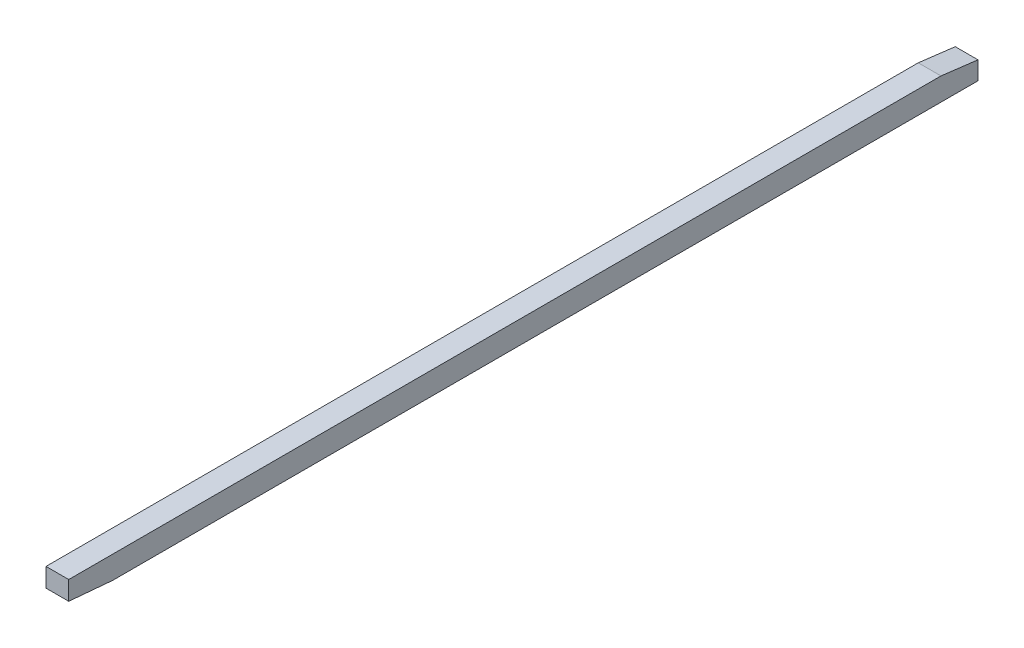
ISO-10303-21;
HEADER;
FILE_DESCRIPTION(('STEP AP214'),'2;1');
FILE_NAME('part.step','',(''),(''),'','','');
FILE_SCHEMA(('AUTOMOTIVE_DESIGN { 1 0 10303 214 1 1 1 1 }'));
ENDSEC;
DATA;
#1=APPLICATION_CONTEXT('core data for automotive mechanical design processes');
#2=APPLICATION_PROTOCOL_DEFINITION('international standard','automotive_design',2000,#1);
#3=PRODUCT_CONTEXT('',#1,'mechanical');
#4=PRODUCT('Part','Part','',(#3));
#5=PRODUCT_RELATED_PRODUCT_CATEGORY('part','',(#4));
#6=PRODUCT_DEFINITION_FORMATION('','',#4);
#7=PRODUCT_DEFINITION_CONTEXT('part definition',#1,'design');
#8=PRODUCT_DEFINITION('design','',#6,#7);
#9=PRODUCT_DEFINITION_SHAPE('','',#8);
#10=(LENGTH_UNIT() NAMED_UNIT(*) SI_UNIT(.MILLI.,.METRE.));
#11=(NAMED_UNIT(*) PLANE_ANGLE_UNIT() SI_UNIT($,.RADIAN.));
#12=(NAMED_UNIT(*) SI_UNIT($,.STERADIAN.) SOLID_ANGLE_UNIT());
#13=UNCERTAINTY_MEASURE_WITH_UNIT(LENGTH_MEASURE(1.E-05),#10,'distance_accuracy_value','');
#14=(GEOMETRIC_REPRESENTATION_CONTEXT(3) GLOBAL_UNCERTAINTY_ASSIGNED_CONTEXT((#13)) GLOBAL_UNIT_ASSIGNED_CONTEXT((#10,
#11,#12)) REPRESENTATION_CONTEXT('',''));
#15=CARTESIAN_POINT('',(0.,0.,0.));
#16=DIRECTION('',(0.,0.,1.));
#17=DIRECTION('',(1.,0.,0.));
#18=AXIS2_PLACEMENT_3D('',#15,#16,#17);
#19=CARTESIAN_POINT('',(0.,0.,101.6));
#20=DIRECTION('',(-1.,0.,0.));
#21=DIRECTION('',(0.,0.,1.));
#22=AXIS2_PLACEMENT_3D('',#19,#20,#21);
#23=PLANE('',#22);
#24=DIRECTION('',(0.,1.,0.));
#25=VECTOR('',#24,1.);
#26=CARTESIAN_POINT('',(0.,0.,0.));
#27=LINE('',#26,#25);
#28=CARTESIAN_POINT('',(0.,0.,0.));
#29=VERTEX_POINT('',#28);
#30=CARTESIAN_POINT('',(0.,2.032,0.));
#31=VERTEX_POINT('',#30);
#32=EDGE_CURVE('E142',#29,#31,#27,.T.);
#33=ORIENTED_EDGE('',*,*,#32,.T.);
#34=DIRECTION('',(0.,-0.121869343405148,-0.992546151641322));
#35=VECTOR('',#34,1.);
#36=CARTESIAN_POINT('',(0.,2.54,4.13732798541108));
#37=LINE('',#36,#35);
#38=CARTESIAN_POINT('',(0.,2.54,4.13732798541108));
#39=VERTEX_POINT('',#38);
#40=EDGE_CURVE('E11',#31,#39,#37,.F.);
#41=ORIENTED_EDGE('',*,*,#40,.T.);
#42=DIRECTION('',(0.,0.,-1.));
#43=VECTOR('',#42,1.);
#44=CARTESIAN_POINT('',(0.,2.54,101.6));
#45=LINE('',#44,#43);
#46=CARTESIAN_POINT('',(0.,2.54,101.6));
#47=VERTEX_POINT('',#46);
#48=EDGE_CURVE('E113',#47,#39,#45,.T.);
#49=ORIENTED_EDGE('',*,*,#48,.F.);
#50=DIRECTION('',(0.,1.,0.));
#51=VECTOR('',#50,1.);
#52=CARTESIAN_POINT('',(0.,0.,101.6));
#53=LINE('',#52,#51);
#54=CARTESIAN_POINT('',(0.,0.430444224547549,101.6));
#55=VERTEX_POINT('',#54);
#56=EDGE_CURVE('E97',#55,#47,#53,.T.);
#57=ORIENTED_EDGE('',*,*,#56,.F.);
#58=DIRECTION('',(0.,-0.0871557427476558,-0.996194698091746));
#59=VECTOR('',#58,1.);
#60=CARTESIAN_POINT('',(0.,0.430444224547549,101.6));
#61=LINE('',#60,#59);
#62=CARTESIAN_POINT('',(0.,0.,96.6799999999999));
#63=VERTEX_POINT('',#62);
#64=EDGE_CURVE('E121',#55,#63,#61,.T.);
#65=ORIENTED_EDGE('',*,*,#64,.T.);
#66=DIRECTION('',(0.,0.,-1.));
#67=VECTOR('',#66,1.);
#68=CARTESIAN_POINT('',(0.,0.,101.6));
#69=LINE('',#68,#67);
#70=EDGE_CURVE('E138',#63,#29,#69,.T.);
#71=ORIENTED_EDGE('',*,*,#70,.T.);
#72=EDGE_LOOP('',(#33,#41,#49,#57,#65,#71));
#73=FACE_BOUND('',#72,.T.);
#74=ADVANCED_FACE('F44',(#73),#23,.F.);
#75=CARTESIAN_POINT('',(0.,2.54,101.6));
#76=DIRECTION('',(0.,-1.,0.));
#77=DIRECTION('',(1.,0.,0.));
#78=AXIS2_PLACEMENT_3D('',#75,#76,#77);
#79=PLANE('',#78);
#80=ORIENTED_EDGE('',*,*,#48,.T.);
#81=DIRECTION('',(-1.,0.,0.));
#82=VECTOR('',#81,1.);
#83=CARTESIAN_POINT('',(0.,2.54,4.13732798541108));
#84=LINE('',#83,#82);
#85=CARTESIAN_POINT('',(-2.54,2.54,4.13732798541108));
#86=VERTEX_POINT('',#85);
#87=EDGE_CURVE('E132',#39,#86,#84,.T.);
#88=ORIENTED_EDGE('',*,*,#87,.T.);
#89=DIRECTION('',(0.,0.,-1.));
#90=VECTOR('',#89,1.);
#91=CARTESIAN_POINT('',(-2.54,2.54,101.6));
#92=LINE('',#91,#90);
#93=CARTESIAN_POINT('',(-2.54,2.54,101.6));
#94=VERTEX_POINT('',#93);
#95=EDGE_CURVE('E115',#94,#86,#92,.T.);
#96=ORIENTED_EDGE('',*,*,#95,.F.);
#97=DIRECTION('',(-1.,0.,0.));
#98=VECTOR('',#97,1.);
#99=CARTESIAN_POINT('',(0.,2.54,101.6));
#100=LINE('',#99,#98);
#101=EDGE_CURVE('E101',#47,#94,#100,.T.);
#102=ORIENTED_EDGE('',*,*,#101,.F.);
#103=EDGE_LOOP('',(#80,#88,#96,#102));
#104=FACE_BOUND('',#103,.T.);
#105=ADVANCED_FACE('F111',(#104),#79,.F.);
#106=CARTESIAN_POINT('',(-2.54,0.,101.6));
#107=DIRECTION('',(1.,0.,0.));
#108=DIRECTION('',(0.,0.,-1.));
#109=AXIS2_PLACEMENT_3D('',#106,#107,#108);
#110=PLANE('',#109);
#111=ORIENTED_EDGE('',*,*,#95,.T.);
#112=DIRECTION('',(0.,0.121869343405148,0.992546151641322));
#113=VECTOR('',#112,1.);
#114=CARTESIAN_POINT('',(-2.54,2.54,4.13732798541108));
#115=LINE('',#114,#113);
#116=CARTESIAN_POINT('',(-2.54,2.032,0.));
#117=VERTEX_POINT('',#116);
#118=EDGE_CURVE('E67',#86,#117,#115,.F.);
#119=ORIENTED_EDGE('',*,*,#118,.T.);
#120=DIRECTION('',(0.,-1.,0.));
#121=VECTOR('',#120,1.);
#122=CARTESIAN_POINT('',(-2.54,0.,0.));
#123=LINE('',#122,#121);
#124=CARTESIAN_POINT('',(-2.54,0.,0.));
#125=VERTEX_POINT('',#124);
#126=EDGE_CURVE('E144',#117,#125,#123,.T.);
#127=ORIENTED_EDGE('',*,*,#126,.T.);
#128=DIRECTION('',(0.,0.,-1.));
#129=VECTOR('',#128,1.);
#130=CARTESIAN_POINT('',(-2.54,0.,101.6));
#131=LINE('',#130,#129);
#132=CARTESIAN_POINT('',(-2.54,0.,96.6799999999999));
#133=VERTEX_POINT('',#132);
#134=EDGE_CURVE('E123',#133,#125,#131,.T.);
#135=ORIENTED_EDGE('',*,*,#134,.F.);
#136=DIRECTION('',(0.,0.0871557427476558,0.996194698091746));
#137=VECTOR('',#136,1.);
#138=CARTESIAN_POINT('',(-2.54,0.430444224547549,101.6));
#139=LINE('',#138,#137);
#140=CARTESIAN_POINT('',(-2.54,0.430444224547549,101.6));
#141=VERTEX_POINT('',#140);
#142=EDGE_CURVE('E130',#133,#141,#139,.T.);
#143=ORIENTED_EDGE('',*,*,#142,.T.);
#144=DIRECTION('',(0.,-1.,0.));
#145=VECTOR('',#144,1.);
#146=CARTESIAN_POINT('',(-2.54,0.,101.6));
#147=LINE('',#146,#145);
#148=EDGE_CURVE('E117',#94,#141,#147,.T.);
#149=ORIENTED_EDGE('',*,*,#148,.F.);
#150=EDGE_LOOP('',(#111,#119,#127,#135,#143,#149));
#151=FACE_BOUND('',#150,.T.);
#152=ADVANCED_FACE('F135',(#151),#110,.F.);
#153=CARTESIAN_POINT('',(0.,0.,101.6));
#154=DIRECTION('',(0.,1.,0.));
#155=DIRECTION('',(-1.,0.,0.));
#156=AXIS2_PLACEMENT_3D('',#153,#154,#155);
#157=PLANE('',#156);
#158=ORIENTED_EDGE('',*,*,#70,.F.);
#159=DIRECTION('',(-1.,0.,0.));
#160=VECTOR('',#159,1.);
#161=CARTESIAN_POINT('',(-2.54,0.,96.6799999999999));
#162=LINE('',#161,#160);
#163=EDGE_CURVE('E128',#63,#133,#162,.T.);
#164=ORIENTED_EDGE('',*,*,#163,.T.);
#165=ORIENTED_EDGE('',*,*,#134,.T.);
#166=DIRECTION('',(1.,0.,0.));
#167=VECTOR('',#166,1.);
#168=CARTESIAN_POINT('',(0.,0.,0.));
#169=LINE('',#168,#167);
#170=EDGE_CURVE('E107',#125,#29,#169,.T.);
#171=ORIENTED_EDGE('',*,*,#170,.T.);
#172=EDGE_LOOP('',(#158,#164,#165,#171));
#173=FACE_BOUND('',#172,.T.);
#174=ADVANCED_FACE('F151',(#173),#157,.F.);
#175=CARTESIAN_POINT('',(0.,0.,101.6));
#176=DIRECTION('',(0.,0.,1.));
#177=DIRECTION('',(1.,0.,0.));
#178=AXIS2_PLACEMENT_3D('',#175,#176,#177);
#179=PLANE('',#178);
#180=ORIENTED_EDGE('',*,*,#148,.T.);
#181=DIRECTION('',(1.,0.,0.));
#182=VECTOR('',#181,1.);
#183=CARTESIAN_POINT('',(0.,0.430444224547549,101.6));
#184=LINE('',#183,#182);
#185=EDGE_CURVE('E104',#141,#55,#184,.T.);
#186=ORIENTED_EDGE('',*,*,#185,.T.);
#187=ORIENTED_EDGE('',*,*,#56,.T.);
#188=ORIENTED_EDGE('',*,*,#101,.T.);
#189=EDGE_LOOP('',(#180,#186,#187,#188));
#190=FACE_BOUND('',#189,.T.);
#191=ADVANCED_FACE('F100',(#190),#179,.T.);
#192=CARTESIAN_POINT('',(0.,0.,0.));
#193=DIRECTION('',(0.,0.,1.));
#194=DIRECTION('',(1.,0.,0.));
#195=AXIS2_PLACEMENT_3D('',#192,#193,#194);
#196=PLANE('',#195);
#197=ORIENTED_EDGE('',*,*,#126,.F.);
#198=DIRECTION('',(1.,0.,0.));
#199=VECTOR('',#198,1.);
#200=CARTESIAN_POINT('',(0.,2.032,0.));
#201=LINE('',#200,#199);
#202=EDGE_CURVE('E53',#117,#31,#201,.T.);
#203=ORIENTED_EDGE('',*,*,#202,.T.);
#204=ORIENTED_EDGE('',*,*,#32,.F.);
#205=ORIENTED_EDGE('',*,*,#170,.F.);
#206=EDGE_LOOP('',(#197,#203,#204,#205));
#207=FACE_BOUND('',#206,.T.);
#208=ADVANCED_FACE('F153',(#207),#196,.F.);
#209=CARTESIAN_POINT('',(0.,0.430444224547549,101.6));
#210=DIRECTION('',(0.,-0.996194698091746,0.0871557427476558));
#211=DIRECTION('',(-1.,0.,0.));
#212=AXIS2_PLACEMENT_3D('',#209,#210,#211);
#213=PLANE('',#212);
#214=ORIENTED_EDGE('',*,*,#142,.F.);
#215=ORIENTED_EDGE('',*,*,#163,.F.);
#216=ORIENTED_EDGE('',*,*,#64,.F.);
#217=ORIENTED_EDGE('',*,*,#185,.F.);
#218=EDGE_LOOP('',(#214,#215,#216,#217));
#219=FACE_BOUND('',#218,.T.);
#220=ADVANCED_FACE('F155',(#219),#213,.T.);
#221=CARTESIAN_POINT('',(0.,2.54,4.13732798541108));
#222=DIRECTION('',(0.,-0.992546151641322,0.121869343405148));
#223=DIRECTION('',(-1.,0.,0.));
#224=AXIS2_PLACEMENT_3D('',#221,#222,#223);
#225=PLANE('',#224);
#226=ORIENTED_EDGE('',*,*,#40,.F.);
#227=ORIENTED_EDGE('',*,*,#202,.F.);
#228=ORIENTED_EDGE('',*,*,#118,.F.);
#229=ORIENTED_EDGE('',*,*,#87,.F.);
#230=EDGE_LOOP('',(#226,#227,#228,#229));
#231=FACE_BOUND('',#230,.T.);
#232=ADVANCED_FACE('F47',(#231),#225,.F.);
#233=CLOSED_SHELL('',(#74,#105,#152,#174,#191,#208,#220,#232));
#234=MANIFOLD_SOLID_BREP('B2',#233);
#235=ADVANCED_BREP_SHAPE_REPRESENTATION('',(#18,#234),#14);
#236=SHAPE_DEFINITION_REPRESENTATION(#9,#235);
ENDSEC;
END-ISO-10303-21;
